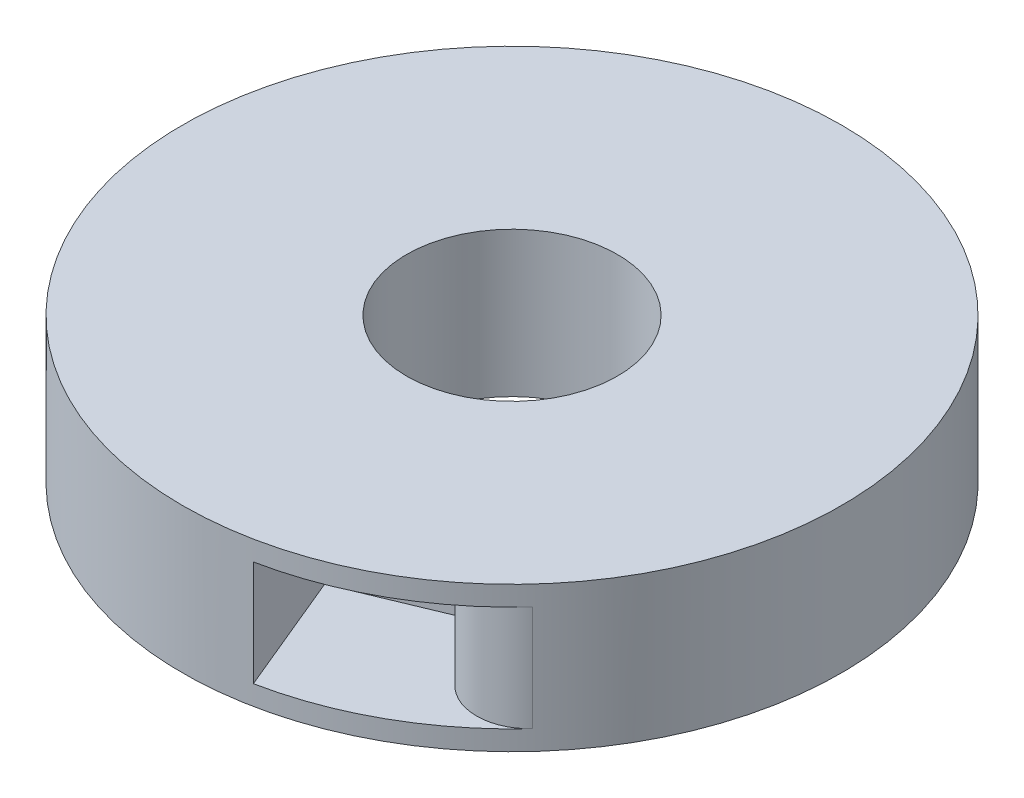
ISO-10303-21;
HEADER;
FILE_DESCRIPTION(('STEP AP214'),'2;1');
FILE_NAME('part.step','',(''),(''),'','','');
FILE_SCHEMA(('AUTOMOTIVE_DESIGN { 1 0 10303 214 1 1 1 1 }'));
ENDSEC;
DATA;
#1=APPLICATION_CONTEXT('core data for automotive mechanical design processes');
#2=APPLICATION_PROTOCOL_DEFINITION('international standard','automotive_design',2000,#1);
#3=PRODUCT_CONTEXT('',#1,'mechanical');
#4=PRODUCT('Part','Part','',(#3));
#5=PRODUCT_RELATED_PRODUCT_CATEGORY('part','',(#4));
#6=PRODUCT_DEFINITION_FORMATION('','',#4);
#7=PRODUCT_DEFINITION_CONTEXT('part definition',#1,'design');
#8=PRODUCT_DEFINITION('design','',#6,#7);
#9=PRODUCT_DEFINITION_SHAPE('','',#8);
#10=(LENGTH_UNIT() NAMED_UNIT(*) SI_UNIT(.MILLI.,.METRE.));
#11=(NAMED_UNIT(*) PLANE_ANGLE_UNIT() SI_UNIT($,.RADIAN.));
#12=(NAMED_UNIT(*) SI_UNIT($,.STERADIAN.) SOLID_ANGLE_UNIT());
#13=UNCERTAINTY_MEASURE_WITH_UNIT(LENGTH_MEASURE(1.E-05),#10,'distance_accuracy_value','');
#14=(GEOMETRIC_REPRESENTATION_CONTEXT(3) GLOBAL_UNCERTAINTY_ASSIGNED_CONTEXT((#13)) GLOBAL_UNIT_ASSIGNED_CONTEXT((#10,
#11,#12)) REPRESENTATION_CONTEXT('',''));
#15=CARTESIAN_POINT('',(0.,0.,0.));
#16=DIRECTION('',(0.,0.,1.));
#17=DIRECTION('',(1.,0.,0.));
#18=AXIS2_PLACEMENT_3D('',#15,#16,#17);
#19=CARTESIAN_POINT('',(4.50448472974768,8.,-1.86945374105606));
#20=DIRECTION('',(0.923615792876126,0.,-0.383319536613781));
#21=DIRECTION('',(-0.383319536613781,0.,-0.923615792876126));
#22=AXIS2_PLACEMENT_3D('',#19,#20,#21);
#23=PLANE('',#22);
#24=DIRECTION('',(0.383319536613782,0.,0.923615792876127));
#25=VECTOR('',#24,1.);
#26=CARTESIAN_POINT('',(4.50448472974768,0.,-1.86945374105606));
#27=LINE('',#26,#25);
#28=CARTESIAN_POINT('',(10.0701621512732,0.,11.5411530075233));
#29=VERTEX_POINT('',#28);
#30=CARTESIAN_POINT('',(11.7996373062726,0.,15.7083566430472));
#31=VERTEX_POINT('',#30);
#32=EDGE_CURVE('E197',#29,#31,#27,.T.);
#33=ORIENTED_EDGE('',*,*,#32,.T.);
#34=DIRECTION('',(0.,-1.,0.));
#35=VECTOR('',#34,1.);
#36=CARTESIAN_POINT('',(11.7996373062726,8.,15.7083566430472));
#37=LINE('',#36,#35);
#38=CARTESIAN_POINT('',(11.7996373062726,8.,15.7083566430472));
#39=VERTEX_POINT('',#38);
#40=EDGE_CURVE('E50',#31,#39,#37,.F.);
#41=ORIENTED_EDGE('',*,*,#40,.T.);
#42=DIRECTION('',(0.383319536613782,0.,0.923615792876127));
#43=VECTOR('',#42,1.);
#44=CARTESIAN_POINT('',(4.50448472974768,8.,-1.86945374105606));
#45=LINE('',#44,#43);
#46=CARTESIAN_POINT('',(10.0701621512732,8.,11.5411530075233));
#47=VERTEX_POINT('',#46);
#48=EDGE_CURVE('E186',#47,#39,#45,.T.);
#49=ORIENTED_EDGE('',*,*,#48,.F.);
#50=DIRECTION('',(0.,-1.,0.));
#51=VECTOR('',#50,1.);
#52=CARTESIAN_POINT('',(10.0701621512732,8.,11.5411530075233));
#53=LINE('',#52,#51);
#54=EDGE_CURVE('E141',#47,#29,#53,.T.);
#55=ORIENTED_EDGE('',*,*,#54,.T.);
#56=EDGE_LOOP('',(#33,#41,#49,#55));
#57=FACE_BOUND('',#56,.T.);
#58=ADVANCED_FACE('F35',(#57),#23,.F.);
#59=CARTESIAN_POINT('',(4.5044847297478,8.,-1.86945374105611));
#60=DIRECTION('',(0.923615792876127,0.,-0.383319536613781));
#61=DIRECTION('',(-0.383319536613781,0.,-0.923615792876127));
#62=AXIS2_PLACEMENT_3D('',#59,#60,#61);
#63=PLANE('',#62);
#64=DIRECTION('',(0.383319536613781,0.,0.923615792876127));
#65=VECTOR('',#64,1.);
#66=CARTESIAN_POINT('',(4.5044847297478,0.,-1.86945374105611));
#67=LINE('',#66,#65);
#68=CARTESIAN_POINT('',(-4.89438805791557,0.,-24.5162184183967));
#69=VERTEX_POINT('',#68);
#70=CARTESIAN_POINT('',(-1.06119269177775,0.,-15.2800604896354));
#71=VERTEX_POINT('',#70);
#72=EDGE_CURVE('E199',#69,#71,#67,.T.);
#73=ORIENTED_EDGE('',*,*,#72,.T.);
#74=DIRECTION('',(0.,-1.,0.));
#75=VECTOR('',#74,1.);
#76=CARTESIAN_POINT('',(-1.06119269177775,8.,-15.2800604896354));
#77=LINE('',#76,#75);
#78=CARTESIAN_POINT('',(-1.06119269177775,8.,-15.2800604896354));
#79=VERTEX_POINT('',#78);
#80=EDGE_CURVE('E139',#79,#71,#77,.T.);
#81=ORIENTED_EDGE('',*,*,#80,.F.);
#82=DIRECTION('',(0.383319536613781,0.,0.923615792876127));
#83=VECTOR('',#82,1.);
#84=CARTESIAN_POINT('',(4.5044847297478,8.,-1.86945374105611));
#85=LINE('',#84,#83);
#86=CARTESIAN_POINT('',(-4.89438805791557,8.,-24.5162184183967));
#87=VERTEX_POINT('',#86);
#88=EDGE_CURVE('E188',#87,#79,#85,.T.);
#89=ORIENTED_EDGE('',*,*,#88,.F.);
#90=DIRECTION('',(0.,-1.,0.));
#91=VECTOR('',#90,1.);
#92=CARTESIAN_POINT('',(-4.89438805791557,8.,-24.5162184183967));
#93=LINE('',#92,#91);
#94=EDGE_CURVE('E147',#87,#69,#93,.T.);
#95=ORIENTED_EDGE('',*,*,#94,.T.);
#96=EDGE_LOOP('',(#73,#81,#89,#95));
#97=FACE_BOUND('',#96,.T.);
#98=ADVANCED_FACE('F222',(#97),#63,.F.);
#99=CARTESIAN_POINT('',(-5.56567742152556,8.,-13.4106067485793));
#100=DIRECTION('',(0.383319536613782,0.,0.923615792876126));
#101=DIRECTION('',(0.923615792876126,0.,-0.383319536613782));
#102=AXIS2_PLACEMENT_3D('',#99,#100,#101);
#103=PLANE('',#102);
#104=DIRECTION('',(-0.923615792876126,0.,0.383319536613782));
#105=VECTOR('',#104,1.);
#106=CARTESIAN_POINT('',(-5.56567742152556,0.,-13.4106067485793));
#107=LINE('',#106,#105);
#108=CARTESIAN_POINT('',(-10.0701621512733,0.,-11.5411530075232));
#109=VERTEX_POINT('',#108);
#110=EDGE_CURVE('E202',#71,#109,#107,.T.);
#111=ORIENTED_EDGE('',*,*,#110,.T.);
#112=DIRECTION('',(0.,-1.,0.));
#113=VECTOR('',#112,1.);
#114=CARTESIAN_POINT('',(-10.0701621512733,8.,-11.5411530075232));
#115=LINE('',#114,#113);
#116=CARTESIAN_POINT('',(-10.0701621512733,8.,-11.5411530075232));
#117=VERTEX_POINT('',#116);
#118=EDGE_CURVE('E135',#117,#109,#115,.T.);
#119=ORIENTED_EDGE('',*,*,#118,.F.);
#120=DIRECTION('',(-0.923615792876126,0.,0.383319536613782));
#121=VECTOR('',#120,1.);
#122=CARTESIAN_POINT('',(-5.56567742152556,8.,-13.4106067485793));
#123=LINE('',#122,#121);
#124=EDGE_CURVE('E190',#79,#117,#123,.T.);
#125=ORIENTED_EDGE('',*,*,#124,.F.);
#126=ORIENTED_EDGE('',*,*,#80,.T.);
#127=EDGE_LOOP('',(#111,#119,#125,#126));
#128=FACE_BOUND('',#127,.T.);
#129=ADVANCED_FACE('F227',(#128),#103,.F.);
#130=CARTESIAN_POINT('',(-4.50448472974767,8.,1.86945374105609));
#131=DIRECTION('',(-0.923615792876124,0.,0.383319536613788));
#132=DIRECTION('',(0.383319536613788,0.,0.923615792876124));
#133=AXIS2_PLACEMENT_3D('',#130,#131,#132);
#134=PLANE('',#133);
#135=DIRECTION('',(-0.383319536613788,0.,-0.923615792876124));
#136=VECTOR('',#135,1.);
#137=CARTESIAN_POINT('',(-4.50448472974767,0.,1.86945374105609));
#138=LINE('',#137,#136);
#139=CARTESIAN_POINT('',(-11.7996373062727,0.,-15.7083566430471));
#140=VERTEX_POINT('',#139);
#141=EDGE_CURVE('E118',#109,#140,#138,.T.);
#142=ORIENTED_EDGE('',*,*,#141,.T.);
#143=DIRECTION('',(0.,-1.,0.));
#144=VECTOR('',#143,1.);
#145=CARTESIAN_POINT('',(-11.7996373062727,8.,-15.7083566430471));
#146=LINE('',#145,#144);
#147=CARTESIAN_POINT('',(-11.7996373062727,8.,-15.7083566430471));
#148=VERTEX_POINT('',#147);
#149=EDGE_CURVE('E154',#140,#148,#146,.F.);
#150=ORIENTED_EDGE('',*,*,#149,.T.);
#151=DIRECTION('',(-0.383319536613788,0.,-0.923615792876124));
#152=VECTOR('',#151,1.);
#153=CARTESIAN_POINT('',(-4.50448472974767,8.,1.86945374105609));
#154=LINE('',#153,#152);
#155=EDGE_CURVE('E171',#117,#148,#154,.T.);
#156=ORIENTED_EDGE('',*,*,#155,.F.);
#157=ORIENTED_EDGE('',*,*,#118,.T.);
#158=EDGE_LOOP('',(#142,#150,#156,#157));
#159=FACE_BOUND('',#158,.T.);
#160=ADVANCED_FACE('F233',(#159),#134,.F.);
#161=CARTESIAN_POINT('',(0.,8.,0.));
#162=DIRECTION('',(0.,-1.,0.));
#163=DIRECTION('',(0.,0.,-1.));
#164=AXIS2_PLACEMENT_3D('',#161,#162,#163);
#165=CYLINDRICAL_SURFACE('',#164,25.);
#166=DIRECTION('',(0.,-1.,0.));
#167=VECTOR('',#166,1.);
#168=CARTESIAN_POINT('',(18.4453577116394,8.,16.8750934483239));
#169=LINE('',#168,#167);
#170=CARTESIAN_POINT('',(18.4453577116394,8.,16.8750934483239));
#171=VERTEX_POINT('',#170);
#172=CARTESIAN_POINT('',(18.4453577116394,0.,16.8750934483239));
#173=VERTEX_POINT('',#172);
#174=EDGE_CURVE('E127',#171,#173,#169,.T.);
#175=ORIENTED_EDGE('',*,*,#174,.T.);
#176=CARTESIAN_POINT('',(0.,0.,0.));
#177=DIRECTION('',(0.,-1.,0.));
#178=DIRECTION('',(0.,0.,-1.));
#179=AXIS2_PLACEMENT_3D('',#176,#177,#178);
#180=CIRCLE('',#179,25.);
#181=CARTESIAN_POINT('',(4.8943880579154,0.,24.5162184183967));
#182=VERTEX_POINT('',#181);
#183=EDGE_CURVE('E112',#173,#182,#180,.T.);
#184=ORIENTED_EDGE('',*,*,#183,.T.);
#185=DIRECTION('',(0.,-1.,0.));
#186=VECTOR('',#185,1.);
#187=CARTESIAN_POINT('',(4.8943880579154,8.,24.5162184183967));
#188=LINE('',#187,#186);
#189=CARTESIAN_POINT('',(4.8943880579154,8.,24.5162184183967));
#190=VERTEX_POINT('',#189);
#191=EDGE_CURVE('E124',#190,#182,#188,.T.);
#192=ORIENTED_EDGE('',*,*,#191,.F.);
#193=CARTESIAN_POINT('',(0.,8.,0.));
#194=DIRECTION('',(0.,1.,0.));
#195=DIRECTION('',(0.,0.,1.));
#196=AXIS2_PLACEMENT_3D('',#193,#194,#195);
#197=CIRCLE('',#196,25.);
#198=EDGE_CURVE('E179',#190,#171,#197,.T.);
#199=ORIENTED_EDGE('',*,*,#198,.T.);
#200=EDGE_LOOP('',(#175,#184,#192,#199));
#201=FACE_BOUND('',#200,.T.);
#202=DIRECTION('',(0.,-1.,0.));
#203=VECTOR('',#202,1.);
#204=CARTESIAN_POINT('',(-18.4453577116395,8.,-16.8750934483238));
#205=LINE('',#204,#203);
#206=CARTESIAN_POINT('',(-18.4453577116395,8.,-16.8750934483238));
#207=VERTEX_POINT('',#206);
#208=CARTESIAN_POINT('',(-18.4453577116395,0.,-16.8750934483238));
#209=VERTEX_POINT('',#208);
#210=EDGE_CURVE('E151',#207,#209,#205,.T.);
#211=ORIENTED_EDGE('',*,*,#210,.T.);
#212=EDGE_CURVE('E129',#209,#69,#180,.T.);
#213=ORIENTED_EDGE('',*,*,#212,.T.);
#214=ORIENTED_EDGE('',*,*,#94,.F.);
#215=EDGE_CURVE('E168',#87,#207,#197,.T.);
#216=ORIENTED_EDGE('',*,*,#215,.T.);
#217=EDGE_LOOP('',(#211,#213,#214,#216));
#218=FACE_BOUND('',#217,.T.);
#219=CARTESIAN_POINT('',(0.,9.5,0.));
#220=DIRECTION('',(0.,1.,0.));
#221=DIRECTION('',(0.,0.,1.));
#222=AXIS2_PLACEMENT_3D('',#219,#220,#221);
#223=CIRCLE('',#222,25.);
#224=CARTESIAN_POINT('',(0.,9.5,25.));
#225=VERTEX_POINT('',#224);
#226=EDGE_CURVE('E181',#225,#225,#223,.T.);
#227=ORIENTED_EDGE('',*,*,#226,.F.);
#228=EDGE_LOOP('',(#227));
#229=FACE_BOUND('',#228,.T.);
#230=CARTESIAN_POINT('',(0.,-1.5,0.));
#231=DIRECTION('',(0.,-1.,0.));
#232=DIRECTION('',(0.,0.,-1.));
#233=AXIS2_PLACEMENT_3D('',#230,#231,#232);
#234=CIRCLE('',#233,25.);
#235=CARTESIAN_POINT('',(0.,-1.5,-25.));
#236=VERTEX_POINT('',#235);
#237=EDGE_CURVE('E128',#236,#236,#234,.T.);
#238=ORIENTED_EDGE('',*,*,#237,.F.);
#239=EDGE_LOOP('',(#238));
#240=FACE_BOUND('',#239,.T.);
#241=ADVANCED_FACE('F122',(#201,#218,#229,#240),#165,.T.);
#242=CARTESIAN_POINT('',(-4.50448472974781,8.,1.86945374105608));
#243=DIRECTION('',(-0.923615792876129,0.,0.383319536613775));
#244=DIRECTION('',(0.383319536613775,0.,0.923615792876129));
#245=AXIS2_PLACEMENT_3D('',#242,#243,#244);
#246=PLANE('',#245);
#247=DIRECTION('',(-0.383319536613775,0.,-0.923615792876129));
#248=VECTOR('',#247,1.);
#249=CARTESIAN_POINT('',(-4.50448472974781,0.,1.86945374105608));
#250=LINE('',#249,#248);
#251=CARTESIAN_POINT('',(1.06119269177765,0.,15.2800604896354));
#252=VERTEX_POINT('',#251);
#253=EDGE_CURVE('E109',#182,#252,#250,.T.);
#254=ORIENTED_EDGE('',*,*,#253,.T.);
#255=DIRECTION('',(0.,-1.,0.));
#256=VECTOR('',#255,1.);
#257=CARTESIAN_POINT('',(1.06119269177765,8.,15.2800604896354));
#258=LINE('',#257,#256);
#259=CARTESIAN_POINT('',(1.06119269177765,8.,15.2800604896354));
#260=VERTEX_POINT('',#259);
#261=EDGE_CURVE('E136',#260,#252,#258,.T.);
#262=ORIENTED_EDGE('',*,*,#261,.F.);
#263=DIRECTION('',(-0.383319536613775,0.,-0.923615792876129));
#264=VECTOR('',#263,1.);
#265=CARTESIAN_POINT('',(-4.50448472974781,8.,1.86945374105608));
#266=LINE('',#265,#264);
#267=EDGE_CURVE('E133',#190,#260,#266,.T.);
#268=ORIENTED_EDGE('',*,*,#267,.F.);
#269=ORIENTED_EDGE('',*,*,#191,.T.);
#270=EDGE_LOOP('',(#254,#262,#268,#269));
#271=FACE_BOUND('',#270,.T.);
#272=ADVANCED_FACE('F131',(#271),#246,.F.);
#273=CARTESIAN_POINT('',(5.56567742152546,8.,13.4106067485794));
#274=DIRECTION('',(-0.383319536613775,0.,-0.923615792876129));
#275=DIRECTION('',(-0.923615792876129,0.,0.383319536613775));
#276=AXIS2_PLACEMENT_3D('',#273,#274,#275);
#277=PLANE('',#276);
#278=DIRECTION('',(0.923615792876129,0.,-0.383319536613775));
#279=VECTOR('',#278,1.);
#280=CARTESIAN_POINT('',(5.56567742152546,0.,13.4106067485794));
#281=LINE('',#280,#279);
#282=EDGE_CURVE('E114',#252,#29,#281,.T.);
#283=ORIENTED_EDGE('',*,*,#282,.T.);
#284=ORIENTED_EDGE('',*,*,#54,.F.);
#285=DIRECTION('',(0.923615792876129,0.,-0.383319536613775));
#286=VECTOR('',#285,1.);
#287=CARTESIAN_POINT('',(5.56567742152546,8.,13.4106067485794));
#288=LINE('',#287,#286);
#289=EDGE_CURVE('E194',#260,#47,#288,.T.);
#290=ORIENTED_EDGE('',*,*,#289,.F.);
#291=ORIENTED_EDGE('',*,*,#261,.T.);
#292=EDGE_LOOP('',(#283,#284,#290,#291));
#293=FACE_BOUND('',#292,.T.);
#294=ADVANCED_FACE('F211',(#293),#277,.F.);
#295=CARTESIAN_POINT('',(0.,8.,0.));
#296=DIRECTION('',(0.,1.,0.));
#297=DIRECTION('',(0.,0.,1.));
#298=AXIS2_PLACEMENT_3D('',#295,#296,#297);
#299=PLANE('',#298);
#300=ORIENTED_EDGE('',*,*,#215,.F.);
#301=ORIENTED_EDGE('',*,*,#88,.T.);
#302=ORIENTED_EDGE('',*,*,#124,.T.);
#303=ORIENTED_EDGE('',*,*,#155,.T.);
#304=CARTESIAN_POINT('',(-15.4941004777772,8.,-14.175078496592));
#305=DIRECTION('',(0.,1.,0.));
#306=DIRECTION('',(0.,0.,1.));
#307=AXIS2_PLACEMENT_3D('',#304,#305,#306);
#308=CIRCLE('',#307,4.);
#309=EDGE_CURVE('E159',#148,#207,#308,.T.);
#310=ORIENTED_EDGE('',*,*,#309,.T.);
#311=EDGE_LOOP('',(#300,#301,#302,#303,#310));
#312=FACE_BOUND('',#311,.T.);
#313=ADVANCED_FACE('F166',(#312),#299,.F.);
#314=ORIENTED_EDGE('',*,*,#289,.T.);
#315=ORIENTED_EDGE('',*,*,#48,.T.);
#316=CARTESIAN_POINT('',(15.4941004777771,8.,14.1750784965921));
#317=DIRECTION('',(0.,1.,0.));
#318=DIRECTION('',(0.,0.,1.));
#319=AXIS2_PLACEMENT_3D('',#316,#317,#318);
#320=CIRCLE('',#319,4.);
#321=EDGE_CURVE('E11',#39,#171,#320,.T.);
#322=ORIENTED_EDGE('',*,*,#321,.T.);
#323=ORIENTED_EDGE('',*,*,#198,.F.);
#324=ORIENTED_EDGE('',*,*,#267,.T.);
#325=EDGE_LOOP('',(#314,#315,#322,#323,#324));
#326=FACE_BOUND('',#325,.T.);
#327=ADVANCED_FACE('F213',(#326),#299,.F.);
#328=CARTESIAN_POINT('',(0.,9.5,0.));
#329=DIRECTION('',(0.,1.,0.));
#330=DIRECTION('',(0.,0.,1.));
#331=AXIS2_PLACEMENT_3D('',#328,#329,#330);
#332=PLANE('',#331);
#333=CARTESIAN_POINT('',(0.,9.5,0.));
#334=DIRECTION('',(0.,1.,0.));
#335=DIRECTION('',(0.,0.,1.));
#336=AXIS2_PLACEMENT_3D('',#333,#334,#335);
#337=CIRCLE('',#336,8.);
#338=CARTESIAN_POINT('',(0.,9.5,8.));
#339=VERTEX_POINT('',#338);
#340=EDGE_CURVE('E268',#339,#339,#337,.T.);
#341=ORIENTED_EDGE('',*,*,#340,.F.);
#342=EDGE_LOOP('',(#341));
#343=FACE_BOUND('',#342,.T.);
#344=ORIENTED_EDGE('',*,*,#226,.T.);
#345=EDGE_LOOP('',(#344));
#346=FACE_BOUND('',#345,.T.);
#347=ADVANCED_FACE('F246',(#343,#346),#332,.T.);
#348=CARTESIAN_POINT('',(0.,0.,0.));
#349=DIRECTION('',(0.,-1.,0.));
#350=DIRECTION('',(0.,0.,-1.));
#351=AXIS2_PLACEMENT_3D('',#348,#349,#350);
#352=PLANE('',#351);
#353=ORIENTED_EDGE('',*,*,#32,.F.);
#354=ORIENTED_EDGE('',*,*,#282,.F.);
#355=ORIENTED_EDGE('',*,*,#253,.F.);
#356=ORIENTED_EDGE('',*,*,#183,.F.);
#357=CARTESIAN_POINT('',(15.4941004777771,0.,14.1750784965921));
#358=DIRECTION('',(0.,-1.,0.));
#359=DIRECTION('',(0.,0.,-1.));
#360=AXIS2_PLACEMENT_3D('',#357,#358,#359);
#361=CIRCLE('',#360,4.);
#362=EDGE_CURVE('E43',#173,#31,#361,.T.);
#363=ORIENTED_EDGE('',*,*,#362,.T.);
#364=EDGE_LOOP('',(#353,#354,#355,#356,#363));
#365=FACE_BOUND('',#364,.T.);
#366=ADVANCED_FACE('F111',(#365),#352,.F.);
#367=CARTESIAN_POINT('',(0.,-1.5,0.));
#368=DIRECTION('',(0.,-1.,0.));
#369=DIRECTION('',(0.,0.,-1.));
#370=AXIS2_PLACEMENT_3D('',#367,#368,#369);
#371=PLANE('',#370);
#372=CARTESIAN_POINT('',(0.,-1.5,0.));
#373=DIRECTION('',(0.,1.,0.));
#374=DIRECTION('',(0.,0.,1.));
#375=AXIS2_PLACEMENT_3D('',#372,#373,#374);
#376=CIRCLE('',#375,8.);
#377=CARTESIAN_POINT('',(0.,-1.5,8.));
#378=VERTEX_POINT('',#377);
#379=EDGE_CURVE('E265',#378,#378,#376,.T.);
#380=ORIENTED_EDGE('',*,*,#379,.T.);
#381=EDGE_LOOP('',(#380));
#382=FACE_BOUND('',#381,.T.);
#383=ORIENTED_EDGE('',*,*,#237,.T.);
#384=EDGE_LOOP('',(#383));
#385=FACE_BOUND('',#384,.T.);
#386=ADVANCED_FACE('F253',(#382,#385),#371,.T.);
#387=ORIENTED_EDGE('',*,*,#141,.F.);
#388=ORIENTED_EDGE('',*,*,#110,.F.);
#389=ORIENTED_EDGE('',*,*,#72,.F.);
#390=ORIENTED_EDGE('',*,*,#212,.F.);
#391=CARTESIAN_POINT('',(-15.4941004777772,0.,-14.175078496592));
#392=DIRECTION('',(0.,-1.,0.));
#393=DIRECTION('',(0.,0.,-1.));
#394=AXIS2_PLACEMENT_3D('',#391,#392,#393);
#395=CIRCLE('',#394,4.);
#396=EDGE_CURVE('E157',#209,#140,#395,.T.);
#397=ORIENTED_EDGE('',*,*,#396,.T.);
#398=EDGE_LOOP('',(#387,#388,#389,#390,#397));
#399=FACE_BOUND('',#398,.T.);
#400=ADVANCED_FACE('F250',(#399),#352,.F.);
#401=CARTESIAN_POINT('',(0.,-1.5,0.));
#402=DIRECTION('',(0.,1.,0.));
#403=DIRECTION('',(0.,0.,1.));
#404=AXIS2_PLACEMENT_3D('',#401,#402,#403);
#405=CYLINDRICAL_SURFACE('',#404,8.);
#406=ORIENTED_EDGE('',*,*,#379,.F.);
#407=EDGE_LOOP('',(#406));
#408=FACE_BOUND('',#407,.T.);
#409=ORIENTED_EDGE('',*,*,#340,.T.);
#410=EDGE_LOOP('',(#409));
#411=FACE_BOUND('',#410,.T.);
#412=ADVANCED_FACE('F220',(#408,#411),#405,.F.);
#413=CARTESIAN_POINT('',(-15.4941004777772,8.,-14.175078496592));
#414=DIRECTION('',(0.,-1.,0.));
#415=DIRECTION('',(0.,0.,-1.));
#416=AXIS2_PLACEMENT_3D('',#413,#414,#415);
#417=CYLINDRICAL_SURFACE('',#416,4.);
#418=ORIENTED_EDGE('',*,*,#309,.F.);
#419=ORIENTED_EDGE('',*,*,#149,.F.);
#420=ORIENTED_EDGE('',*,*,#396,.F.);
#421=ORIENTED_EDGE('',*,*,#210,.F.);
#422=EDGE_LOOP('',(#418,#419,#420,#421));
#423=FACE_BOUND('',#422,.T.);
#424=ADVANCED_FACE('F175',(#423),#417,.T.);
#425=CARTESIAN_POINT('',(15.4941004777771,8.,14.1750784965921));
#426=DIRECTION('',(0.,-1.,0.));
#427=DIRECTION('',(0.,0.,-1.));
#428=AXIS2_PLACEMENT_3D('',#425,#426,#427);
#429=CYLINDRICAL_SURFACE('',#428,4.);
#430=ORIENTED_EDGE('',*,*,#321,.F.);
#431=ORIENTED_EDGE('',*,*,#40,.F.);
#432=ORIENTED_EDGE('',*,*,#362,.F.);
#433=ORIENTED_EDGE('',*,*,#174,.F.);
#434=EDGE_LOOP('',(#430,#431,#432,#433));
#435=FACE_BOUND('',#434,.T.);
#436=ADVANCED_FACE('F37',(#435),#429,.T.);
#437=CLOSED_SHELL('',(#58,#98,#129,#160,#241,#272,#294,#313,#327,#347,#366,#386,#400,#412,#424,#436));
#438=MANIFOLD_SOLID_BREP('B2',#437);
#439=ADVANCED_BREP_SHAPE_REPRESENTATION('',(#18,#438),#14);
#440=SHAPE_DEFINITION_REPRESENTATION(#9,#439);
ENDSEC;
END-ISO-10303-21;
